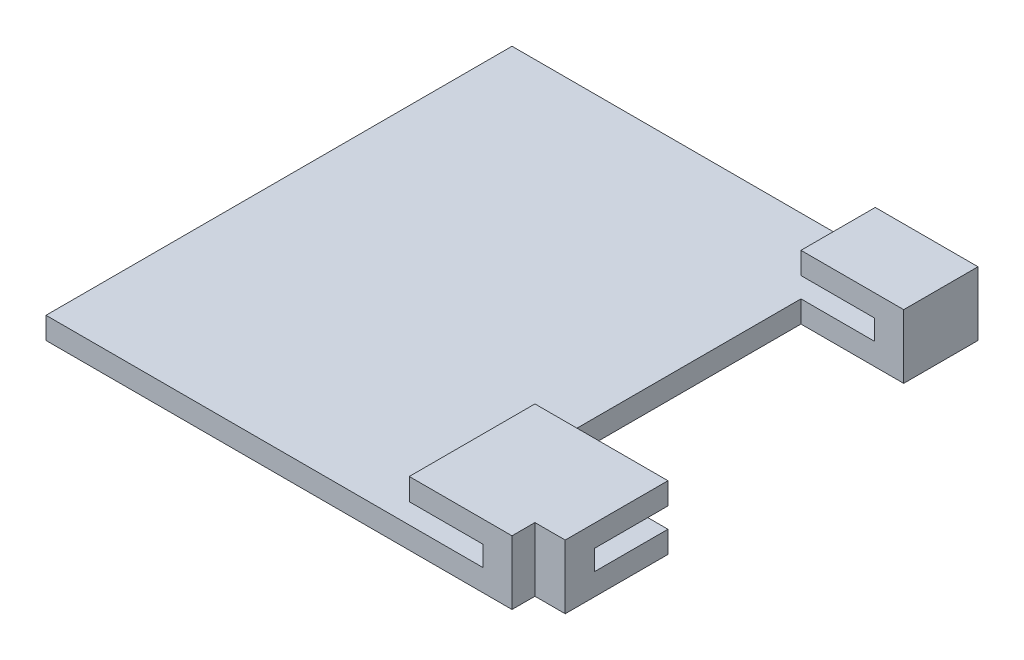
ISO-10303-21;
HEADER;
FILE_DESCRIPTION(('STEP AP214'),'2;1');
FILE_NAME('part.step','',(''),(''),'','','');
FILE_SCHEMA(('AUTOMOTIVE_DESIGN { 1 0 10303 214 1 1 1 1 }'));
ENDSEC;
DATA;
#1=APPLICATION_CONTEXT('core data for automotive mechanical design processes');
#2=APPLICATION_PROTOCOL_DEFINITION('international standard','automotive_design',2000,#1);
#3=PRODUCT_CONTEXT('',#1,'mechanical');
#4=PRODUCT('Part','Part','',(#3));
#5=PRODUCT_RELATED_PRODUCT_CATEGORY('part','',(#4));
#6=PRODUCT_DEFINITION_FORMATION('','',#4);
#7=PRODUCT_DEFINITION_CONTEXT('part definition',#1,'design');
#8=PRODUCT_DEFINITION('design','',#6,#7);
#9=PRODUCT_DEFINITION_SHAPE('','',#8);
#10=(LENGTH_UNIT() NAMED_UNIT(*) SI_UNIT(.MILLI.,.METRE.));
#11=(NAMED_UNIT(*) PLANE_ANGLE_UNIT() SI_UNIT($,.RADIAN.));
#12=(NAMED_UNIT(*) SI_UNIT($,.STERADIAN.) SOLID_ANGLE_UNIT());
#13=UNCERTAINTY_MEASURE_WITH_UNIT(LENGTH_MEASURE(1.E-05),#10,'distance_accuracy_value','');
#14=(GEOMETRIC_REPRESENTATION_CONTEXT(3) GLOBAL_UNCERTAINTY_ASSIGNED_CONTEXT((#13)) GLOBAL_UNIT_ASSIGNED_CONTEXT((#10,
#11,#12)) REPRESENTATION_CONTEXT('',''));
#15=CARTESIAN_POINT('',(0.,0.,0.));
#16=DIRECTION('',(0.,0.,1.));
#17=DIRECTION('',(1.,0.,0.));
#18=AXIS2_PLACEMENT_3D('',#15,#16,#17);
#19=CARTESIAN_POINT('',(0.,-4.58124991800001,11.699999968));
#20=DIRECTION('',(0.,0.,-1.));
#21=DIRECTION('',(-1.,0.,0.));
#22=AXIS2_PLACEMENT_3D('',#19,#20,#21);
#23=PLANE('',#22);
#24=DIRECTION('',(1.,0.,0.));
#25=VECTOR('',#24,1.);
#26=CARTESIAN_POINT('',(8.024999952,-2.199999918,11.699999968));
#27=LINE('',#26,#25);
#28=CARTESIAN_POINT('',(0.,-2.199999918,11.699999968));
#29=VERTEX_POINT('',#28);
#30=CARTESIAN_POINT('',(14.501999952,-2.19999991800001,11.699999968));
#31=VERTEX_POINT('',#30);
#32=EDGE_CURVE('E239',#29,#31,#27,.T.);
#33=ORIENTED_EDGE('',*,*,#32,.T.);
#34=DIRECTION('',(0.,1.,0.));
#35=VECTOR('',#34,1.);
#36=CARTESIAN_POINT('',(14.501999952,0.,11.699999968));
#37=LINE('',#36,#35);
#38=CARTESIAN_POINT('',(14.501999952,-4.581249918,11.699999968));
#39=VERTEX_POINT('',#38);
#40=EDGE_CURVE('E350',#39,#31,#37,.T.);
#41=ORIENTED_EDGE('',*,*,#40,.F.);
#42=DIRECTION('',(-1.,0.,0.));
#43=VECTOR('',#42,1.);
#44=CARTESIAN_POINT('',(0.,-4.58124991800001,11.699999968));
#45=LINE('',#44,#43);
#46=CARTESIAN_POINT('',(0.,-4.58124991800001,11.699999968));
#47=VERTEX_POINT('',#46);
#48=EDGE_CURVE('E354',#39,#47,#45,.T.);
#49=ORIENTED_EDGE('',*,*,#48,.T.);
#50=DIRECTION('',(0.,1.,0.));
#51=VECTOR('',#50,1.);
#52=CARTESIAN_POINT('',(0.,-4.58124991800001,11.699999968));
#53=LINE('',#52,#51);
#54=EDGE_CURVE('E302',#47,#29,#53,.T.);
#55=ORIENTED_EDGE('',*,*,#54,.T.);
#56=EDGE_LOOP('',(#33,#41,#49,#55));
#57=FACE_BOUND('',#56,.T.);
#58=ADVANCED_FACE('F41',(#57),#23,.T.);
#59=CARTESIAN_POINT('',(11.199999952,-4.581249918,25.4));
#60=DIRECTION('',(-1.,0.,0.));
#61=DIRECTION('',(0.,-1.,0.));
#62=AXIS2_PLACEMENT_3D('',#59,#60,#61);
#63=PLANE('',#62);
#64=DIRECTION('',(0.,-1.,0.));
#65=VECTOR('',#64,1.);
#66=CARTESIAN_POINT('',(11.199999952,0.,22.89999992));
#67=LINE('',#66,#65);
#68=CARTESIAN_POINT('',(11.199999952,2.38125,22.89999992));
#69=VERTEX_POINT('',#68);
#70=CARTESIAN_POINT('',(11.199999952,-4.581249918,22.89999992));
#71=VERTEX_POINT('',#70);
#72=EDGE_CURVE('E60',#69,#71,#67,.T.);
#73=ORIENTED_EDGE('',*,*,#72,.F.);
#74=DIRECTION('',(0.,0.,-1.));
#75=VECTOR('',#74,1.);
#76=CARTESIAN_POINT('',(11.199999952,2.38125,25.4));
#77=LINE('',#76,#75);
#78=CARTESIAN_POINT('',(11.199999952,2.38125,25.4));
#79=VERTEX_POINT('',#78);
#80=EDGE_CURVE('E263',#79,#69,#77,.T.);
#81=ORIENTED_EDGE('',*,*,#80,.F.);
#82=DIRECTION('',(0.,1.,0.));
#83=VECTOR('',#82,1.);
#84=CARTESIAN_POINT('',(11.199999952,-4.581249918,25.4));
#85=LINE('',#84,#83);
#86=CARTESIAN_POINT('',(11.199999952,-4.581249918,25.4));
#87=VERTEX_POINT('',#86);
#88=EDGE_CURVE('E318',#87,#79,#85,.T.);
#89=ORIENTED_EDGE('',*,*,#88,.F.);
#90=DIRECTION('',(0.,0.,-1.));
#91=VECTOR('',#90,1.);
#92=CARTESIAN_POINT('',(11.199999952,-4.581249918,25.4));
#93=LINE('',#92,#91);
#94=EDGE_CURVE('E56',#87,#71,#93,.T.);
#95=ORIENTED_EDGE('',*,*,#94,.T.);
#96=EDGE_LOOP('',(#73,#81,#89,#95));
#97=FACE_BOUND('',#96,.T.);
#98=ADVANCED_FACE('F340',(#97),#63,.F.);
#99=CARTESIAN_POINT('',(0.,2.38125,25.4));
#100=DIRECTION('',(1.,0.,0.));
#101=DIRECTION('',(0.,1.,0.));
#102=AXIS2_PLACEMENT_3D('',#99,#100,#101);
#103=PLANE('',#102);
#104=CARTESIAN_POINT('',(0.,0.,11.699999968));
#105=VERTEX_POINT('',#104);
#106=CARTESIAN_POINT('',(0.,2.38125,11.699999968));
#107=VERTEX_POINT('',#106);
#108=EDGE_CURVE('E331',#105,#107,#53,.T.);
#109=ORIENTED_EDGE('',*,*,#108,.F.);
#110=DIRECTION('',(0.,0.,-1.));
#111=VECTOR('',#110,1.);
#112=CARTESIAN_POINT('',(0.,0.,25.4));
#113=LINE('',#112,#111);
#114=CARTESIAN_POINT('',(0.,0.,25.4));
#115=VERTEX_POINT('',#114);
#116=EDGE_CURVE('E11',#115,#105,#113,.T.);
#117=ORIENTED_EDGE('',*,*,#116,.F.);
#118=DIRECTION('',(0.,-1.,0.));
#119=VECTOR('',#118,1.);
#120=CARTESIAN_POINT('',(0.,2.38125,25.4));
#121=LINE('',#120,#119);
#122=CARTESIAN_POINT('',(0.,2.38125,25.4));
#123=VERTEX_POINT('',#122);
#124=EDGE_CURVE('E258',#123,#115,#121,.T.);
#125=ORIENTED_EDGE('',*,*,#124,.F.);
#126=DIRECTION('',(0.,0.,-1.));
#127=VECTOR('',#126,1.);
#128=CARTESIAN_POINT('',(0.,2.38125,25.4));
#129=LINE('',#128,#127);
#130=EDGE_CURVE('E259',#123,#107,#129,.T.);
#131=ORIENTED_EDGE('',*,*,#130,.T.);
#132=EDGE_LOOP('',(#109,#117,#125,#131));
#133=FACE_BOUND('',#132,.T.);
#134=ADVANCED_FACE('F43',(#133),#103,.F.);
#135=DIRECTION('',(0.,1.,0.));
#136=VECTOR('',#135,1.);
#137=CARTESIAN_POINT('',(0.,-4.58124991800001,-17.299999944));
#138=LINE('',#137,#136);
#139=CARTESIAN_POINT('',(0.,0.,-17.299999944));
#140=VERTEX_POINT('',#139);
#141=CARTESIAN_POINT('',(0.,2.38125,-17.299999944));
#142=VERTEX_POINT('',#141);
#143=EDGE_CURVE('E291',#140,#142,#138,.T.);
#144=ORIENTED_EDGE('',*,*,#143,.T.);
#145=CARTESIAN_POINT('',(0.,2.38125,-25.4));
#146=VERTEX_POINT('',#145);
#147=EDGE_CURVE('E235',#142,#146,#129,.T.);
#148=ORIENTED_EDGE('',*,*,#147,.T.);
#149=DIRECTION('',(0.,-1.,0.));
#150=VECTOR('',#149,1.);
#151=CARTESIAN_POINT('',(0.,2.38125,-25.4));
#152=LINE('',#151,#150);
#153=CARTESIAN_POINT('',(0.,0.,-25.4));
#154=VERTEX_POINT('',#153);
#155=EDGE_CURVE('E228',#146,#154,#152,.T.);
#156=ORIENTED_EDGE('',*,*,#155,.T.);
#157=EDGE_CURVE('E49',#140,#154,#113,.T.);
#158=ORIENTED_EDGE('',*,*,#157,.F.);
#159=EDGE_LOOP('',(#144,#148,#156,#158));
#160=FACE_BOUND('',#159,.T.);
#161=ADVANCED_FACE('F233',(#160),#103,.F.);
#162=CARTESIAN_POINT('',(0.,0.,25.4));
#163=DIRECTION('',(0.,1.,0.));
#164=DIRECTION('',(0.,0.,1.));
#165=AXIS2_PLACEMENT_3D('',#162,#163,#164);
#166=PLANE('',#165);
#167=DIRECTION('',(-1.,0.,0.));
#168=VECTOR('',#167,1.);
#169=CARTESIAN_POINT('',(0.,0.,11.699999968));
#170=LINE('',#169,#168);
#171=CARTESIAN_POINT('',(14.501999952,0.,11.699999968));
#172=VERTEX_POINT('',#171);
#173=EDGE_CURVE('E237',#172,#105,#170,.T.);
#174=ORIENTED_EDGE('',*,*,#173,.F.);
#175=DIRECTION('',(0.,0.,1.));
#176=VECTOR('',#175,1.);
#177=CARTESIAN_POINT('',(14.501999952,0.,0.));
#178=LINE('',#177,#176);
#179=CARTESIAN_POINT('',(14.501999952,0.,19.72499992));
#180=VERTEX_POINT('',#179);
#181=EDGE_CURVE('E380',#172,#180,#178,.T.);
#182=ORIENTED_EDGE('',*,*,#181,.T.);
#183=DIRECTION('',(-1.,0.,0.));
#184=VECTOR('',#183,1.);
#185=CARTESIAN_POINT('',(14.501999952,0.,19.72499992));
#186=LINE('',#185,#184);
#187=CARTESIAN_POINT('',(8.02499995199999,0.,19.72499992));
#188=VERTEX_POINT('',#187);
#189=EDGE_CURVE('E190',#180,#188,#186,.T.);
#190=ORIENTED_EDGE('',*,*,#189,.T.);
#191=DIRECTION('',(0.,0.,-1.));
#192=VECTOR('',#191,1.);
#193=CARTESIAN_POINT('',(8.024999952,0.,25.4));
#194=LINE('',#193,#192);
#195=CARTESIAN_POINT('',(8.024999952,0.,25.4));
#196=VERTEX_POINT('',#195);
#197=EDGE_CURVE('E199',#196,#188,#194,.T.);
#198=ORIENTED_EDGE('',*,*,#197,.F.);
#199=DIRECTION('',(1.,0.,0.));
#200=VECTOR('',#199,1.);
#201=CARTESIAN_POINT('',(0.,0.,25.4));
#202=LINE('',#201,#200);
#203=EDGE_CURVE('E311',#115,#196,#202,.T.);
#204=ORIENTED_EDGE('',*,*,#203,.F.);
#205=ORIENTED_EDGE('',*,*,#116,.T.);
#206=EDGE_LOOP('',(#174,#182,#190,#198,#204,#205));
#207=FACE_BOUND('',#206,.T.);
#208=ADVANCED_FACE('F333',(#207),#166,.F.);
#209=DIRECTION('',(1.,0.,0.));
#210=VECTOR('',#209,1.);
#211=CARTESIAN_POINT('',(0.,0.,-17.299999944));
#212=LINE('',#211,#210);
#213=CARTESIAN_POINT('',(8.024999952,0.,-17.299999944));
#214=VERTEX_POINT('',#213);
#215=EDGE_CURVE('E220',#140,#214,#212,.T.);
#216=ORIENTED_EDGE('',*,*,#215,.F.);
#217=ORIENTED_EDGE('',*,*,#157,.T.);
#218=DIRECTION('',(1.,0.,0.));
#219=VECTOR('',#218,1.);
#220=CARTESIAN_POINT('',(0.,0.,-25.4));
#221=LINE('',#220,#219);
#222=CARTESIAN_POINT('',(8.024999952,0.,-25.4));
#223=VERTEX_POINT('',#222);
#224=EDGE_CURVE('E218',#154,#223,#221,.T.);
#225=ORIENTED_EDGE('',*,*,#224,.T.);
#226=EDGE_CURVE('E205',#214,#223,#194,.T.);
#227=ORIENTED_EDGE('',*,*,#226,.F.);
#228=EDGE_LOOP('',(#216,#217,#225,#227));
#229=FACE_BOUND('',#228,.T.);
#230=ADVANCED_FACE('F216',(#229),#166,.F.);
#231=CARTESIAN_POINT('',(8.024999952,0.,25.4));
#232=DIRECTION('',(1.,0.,0.));
#233=DIRECTION('',(0.,0.,-1.));
#234=AXIS2_PLACEMENT_3D('',#231,#232,#233);
#235=PLANE('',#234);
#236=ORIENTED_EDGE('',*,*,#197,.T.);
#237=DIRECTION('',(0.,1.,0.));
#238=VECTOR('',#237,1.);
#239=CARTESIAN_POINT('',(8.02499995199999,0.,19.72499992));
#240=LINE('',#239,#238);
#241=CARTESIAN_POINT('',(8.02499995199999,-2.199999918,19.72499992));
#242=VERTEX_POINT('',#241);
#243=EDGE_CURVE('E182',#242,#188,#240,.T.);
#244=ORIENTED_EDGE('',*,*,#243,.F.);
#245=DIRECTION('',(0.,0.,-1.));
#246=VECTOR('',#245,1.);
#247=CARTESIAN_POINT('',(8.024999952,-2.199999918,25.4));
#248=LINE('',#247,#246);
#249=CARTESIAN_POINT('',(8.024999952,-2.199999918,25.4));
#250=VERTEX_POINT('',#249);
#251=EDGE_CURVE('E196',#250,#242,#248,.T.);
#252=ORIENTED_EDGE('',*,*,#251,.F.);
#253=DIRECTION('',(0.,-1.,0.));
#254=VECTOR('',#253,1.);
#255=CARTESIAN_POINT('',(8.024999952,0.,25.4));
#256=LINE('',#255,#254);
#257=EDGE_CURVE('E313',#196,#250,#256,.T.);
#258=ORIENTED_EDGE('',*,*,#257,.F.);
#259=EDGE_LOOP('',(#236,#244,#252,#258));
#260=FACE_BOUND('',#259,.T.);
#261=ADVANCED_FACE('F194',(#260),#235,.F.);
#262=DIRECTION('',(0.,-1.,0.));
#263=VECTOR('',#262,1.);
#264=CARTESIAN_POINT('',(8.024999952,0.,-17.299999944));
#265=LINE('',#264,#263);
#266=CARTESIAN_POINT('',(8.024999952,-2.199999918,-17.299999944));
#267=VERTEX_POINT('',#266);
#268=EDGE_CURVE('E301',#214,#267,#265,.T.);
#269=ORIENTED_EDGE('',*,*,#268,.F.);
#270=ORIENTED_EDGE('',*,*,#226,.T.);
#271=DIRECTION('',(0.,-1.,0.));
#272=VECTOR('',#271,1.);
#273=CARTESIAN_POINT('',(8.024999952,0.,-25.4));
#274=LINE('',#273,#272);
#275=CARTESIAN_POINT('',(8.024999952,-2.199999918,-25.4));
#276=VERTEX_POINT('',#275);
#277=EDGE_CURVE('E231',#223,#276,#274,.T.);
#278=ORIENTED_EDGE('',*,*,#277,.T.);
#279=EDGE_CURVE('E206',#267,#276,#248,.T.);
#280=ORIENTED_EDGE('',*,*,#279,.F.);
#281=EDGE_LOOP('',(#269,#270,#278,#280));
#282=FACE_BOUND('',#281,.T.);
#283=ADVANCED_FACE('F426',(#282),#235,.F.);
#284=CARTESIAN_POINT('',(8.024999952,-2.199999918,25.4));
#285=DIRECTION('',(0.,-1.,0.));
#286=DIRECTION('',(1.,0.,0.));
#287=AXIS2_PLACEMENT_3D('',#284,#285,#286);
#288=PLANE('',#287);
#289=ORIENTED_EDGE('',*,*,#32,.F.);
#290=DIRECTION('',(0.,0.,-1.));
#291=VECTOR('',#290,1.);
#292=CARTESIAN_POINT('',(0.,-2.199999918,25.4));
#293=LINE('',#292,#291);
#294=CARTESIAN_POINT('',(0.,-2.199999918,-17.299999944));
#295=VERTEX_POINT('',#294);
#296=EDGE_CURVE('E305',#29,#295,#293,.T.);
#297=ORIENTED_EDGE('',*,*,#296,.T.);
#298=DIRECTION('',(-1.,0.,0.));
#299=VECTOR('',#298,1.);
#300=CARTESIAN_POINT('',(8.024999952,-2.199999918,-17.299999944));
#301=LINE('',#300,#299);
#302=EDGE_CURVE('E299',#267,#295,#301,.T.);
#303=ORIENTED_EDGE('',*,*,#302,.F.);
#304=ORIENTED_EDGE('',*,*,#279,.T.);
#305=DIRECTION('',(-1.,0.,0.));
#306=VECTOR('',#305,1.);
#307=CARTESIAN_POINT('',(8.024999952,-2.199999918,-25.4));
#308=LINE('',#307,#306);
#309=CARTESIAN_POINT('',(-39.600000048,-2.19999991800001,-25.4));
#310=VERTEX_POINT('',#309);
#311=EDGE_CURVE('E246',#276,#310,#308,.T.);
#312=ORIENTED_EDGE('',*,*,#311,.T.);
#313=DIRECTION('',(0.,0.,-1.));
#314=VECTOR('',#313,1.);
#315=CARTESIAN_POINT('',(-39.600000048,-2.19999991800001,25.4));
#316=LINE('',#315,#314);
#317=CARTESIAN_POINT('',(-39.600000048,-2.19999991800001,25.4));
#318=VERTEX_POINT('',#317);
#319=EDGE_CURVE('E208',#318,#310,#316,.T.);
#320=ORIENTED_EDGE('',*,*,#319,.F.);
#321=DIRECTION('',(-1.,0.,0.));
#322=VECTOR('',#321,1.);
#323=CARTESIAN_POINT('',(8.024999952,-2.199999918,25.4));
#324=LINE('',#323,#322);
#325=EDGE_CURVE('E204',#250,#318,#324,.T.);
#326=ORIENTED_EDGE('',*,*,#325,.F.);
#327=ORIENTED_EDGE('',*,*,#251,.T.);
#328=DIRECTION('',(-1.,0.,0.));
#329=VECTOR('',#328,1.);
#330=CARTESIAN_POINT('',(14.501999952,-2.19999991800001,19.72499992));
#331=LINE('',#330,#329);
#332=CARTESIAN_POINT('',(14.501999952,-2.19999991800001,19.72499992));
#333=VERTEX_POINT('',#332);
#334=EDGE_CURVE('E178',#333,#242,#331,.T.);
#335=ORIENTED_EDGE('',*,*,#334,.F.);
#336=DIRECTION('',(0.,0.,1.));
#337=VECTOR('',#336,1.);
#338=CARTESIAN_POINT('',(14.501999952,-2.19999991800001,0.));
#339=LINE('',#338,#337);
#340=EDGE_CURVE('E369',#31,#333,#339,.T.);
#341=ORIENTED_EDGE('',*,*,#340,.F.);
#342=EDGE_LOOP('',(#289,#297,#303,#304,#312,#320,#326,#327,#335,#341));
#343=FACE_BOUND('',#342,.T.);
#344=ADVANCED_FACE('F202',(#343),#288,.F.);
#345=CARTESIAN_POINT('',(-39.600000048,-4.581249918,25.4));
#346=DIRECTION('',(0.,1.,0.));
#347=DIRECTION('',(-1.,0.,0.));
#348=AXIS2_PLACEMENT_3D('',#345,#346,#347);
#349=PLANE('',#348);
#350=ORIENTED_EDGE('',*,*,#48,.F.);
#351=DIRECTION('',(0.,0.,-1.));
#352=VECTOR('',#351,1.);
#353=CARTESIAN_POINT('',(14.501999952,-4.581249918,0.));
#354=LINE('',#353,#352);
#355=CARTESIAN_POINT('',(14.501999952,-4.581249918,22.89999992));
#356=VERTEX_POINT('',#355);
#357=EDGE_CURVE('E375',#356,#39,#354,.T.);
#358=ORIENTED_EDGE('',*,*,#357,.F.);
#359=DIRECTION('',(-1.,0.,0.));
#360=VECTOR('',#359,1.);
#361=CARTESIAN_POINT('',(14.501999952,-4.581249918,22.89999992));
#362=LINE('',#361,#360);
#363=EDGE_CURVE('E339',#356,#71,#362,.T.);
#364=ORIENTED_EDGE('',*,*,#363,.T.);
#365=ORIENTED_EDGE('',*,*,#94,.F.);
#366=DIRECTION('',(1.,0.,0.));
#367=VECTOR('',#366,1.);
#368=CARTESIAN_POINT('',(-39.600000048,-4.581249918,25.4));
#369=LINE('',#368,#367);
#370=CARTESIAN_POINT('',(-39.600000048,-4.581249918,25.4));
#371=VERTEX_POINT('',#370);
#372=EDGE_CURVE('E317',#371,#87,#369,.T.);
#373=ORIENTED_EDGE('',*,*,#372,.F.);
#374=DIRECTION('',(0.,0.,-1.));
#375=VECTOR('',#374,1.);
#376=CARTESIAN_POINT('',(-39.600000048,-4.581249918,25.4));
#377=LINE('',#376,#375);
#378=CARTESIAN_POINT('',(-39.600000048,-4.581249918,-25.4));
#379=VERTEX_POINT('',#378);
#380=EDGE_CURVE('E266',#371,#379,#377,.T.);
#381=ORIENTED_EDGE('',*,*,#380,.T.);
#382=DIRECTION('',(1.,0.,0.));
#383=VECTOR('',#382,1.);
#384=CARTESIAN_POINT('',(-39.600000048,-4.581249918,-25.4));
#385=LINE('',#384,#383);
#386=CARTESIAN_POINT('',(11.199999952,-4.581249918,-25.4));
#387=VERTEX_POINT('',#386);
#388=EDGE_CURVE('E250',#379,#387,#385,.T.);
#389=ORIENTED_EDGE('',*,*,#388,.T.);
#390=CARTESIAN_POINT('',(11.199999952,-4.581249918,-17.299999944));
#391=VERTEX_POINT('',#390);
#392=EDGE_CURVE('E265',#391,#387,#93,.T.);
#393=ORIENTED_EDGE('',*,*,#392,.F.);
#394=DIRECTION('',(1.,0.,0.));
#395=VECTOR('',#394,1.);
#396=CARTESIAN_POINT('',(0.,-4.58124991800001,-17.299999944));
#397=LINE('',#396,#395);
#398=CARTESIAN_POINT('',(0.,-4.58124991800001,-17.299999944));
#399=VERTEX_POINT('',#398);
#400=EDGE_CURVE('E283',#399,#391,#397,.T.);
#401=ORIENTED_EDGE('',*,*,#400,.F.);
#402=DIRECTION('',(0.,0.,1.));
#403=VECTOR('',#402,1.);
#404=CARTESIAN_POINT('',(0.,-4.58124991800001,0.));
#405=LINE('',#404,#403);
#406=EDGE_CURVE('E292',#399,#47,#405,.T.);
#407=ORIENTED_EDGE('',*,*,#406,.T.);
#408=EDGE_LOOP('',(#350,#358,#364,#365,#373,#381,#389,#393,#401,#407));
#409=FACE_BOUND('',#408,.T.);
#410=ADVANCED_FACE('F280',(#409),#349,.F.);
#411=DIRECTION('',(0.,1.,0.));
#412=VECTOR('',#411,1.);
#413=CARTESIAN_POINT('',(11.199999952,-4.581249918,-17.299999944));
#414=LINE('',#413,#412);
#415=CARTESIAN_POINT('',(11.199999952,2.38125,-17.299999944));
#416=VERTEX_POINT('',#415);
#417=EDGE_CURVE('E288',#391,#416,#414,.T.);
#418=ORIENTED_EDGE('',*,*,#417,.F.);
#419=ORIENTED_EDGE('',*,*,#392,.T.);
#420=DIRECTION('',(0.,1.,0.));
#421=VECTOR('',#420,1.);
#422=CARTESIAN_POINT('',(11.199999952,-4.581249918,-25.4));
#423=LINE('',#422,#421);
#424=CARTESIAN_POINT('',(11.199999952,2.38125,-25.4));
#425=VERTEX_POINT('',#424);
#426=EDGE_CURVE('E253',#387,#425,#423,.T.);
#427=ORIENTED_EDGE('',*,*,#426,.T.);
#428=EDGE_CURVE('E262',#416,#425,#77,.T.);
#429=ORIENTED_EDGE('',*,*,#428,.F.);
#430=EDGE_LOOP('',(#418,#419,#427,#429));
#431=FACE_BOUND('',#430,.T.);
#432=ADVANCED_FACE('F286',(#431),#63,.F.);
#433=CARTESIAN_POINT('',(11.199999952,2.38125,25.4));
#434=DIRECTION('',(0.,-1.,0.));
#435=DIRECTION('',(1.,0.,0.));
#436=AXIS2_PLACEMENT_3D('',#433,#434,#435);
#437=PLANE('',#436);
#438=DIRECTION('',(-1.,0.,0.));
#439=VECTOR('',#438,1.);
#440=CARTESIAN_POINT('',(0.,2.38125,11.699999968));
#441=LINE('',#440,#439);
#442=CARTESIAN_POINT('',(14.501999952,2.38125,11.699999968));
#443=VERTEX_POINT('',#442);
#444=EDGE_CURVE('E189',#443,#107,#441,.T.);
#445=ORIENTED_EDGE('',*,*,#444,.T.);
#446=ORIENTED_EDGE('',*,*,#130,.F.);
#447=DIRECTION('',(-1.,0.,0.));
#448=VECTOR('',#447,1.);
#449=CARTESIAN_POINT('',(11.199999952,2.38125,25.4));
#450=LINE('',#449,#448);
#451=EDGE_CURVE('E242',#79,#123,#450,.T.);
#452=ORIENTED_EDGE('',*,*,#451,.F.);
#453=ORIENTED_EDGE('',*,*,#80,.T.);
#454=DIRECTION('',(-1.,0.,0.));
#455=VECTOR('',#454,1.);
#456=CARTESIAN_POINT('',(14.501999952,2.38125,22.89999992));
#457=LINE('',#456,#455);
#458=CARTESIAN_POINT('',(14.501999952,2.38125,22.89999992));
#459=VERTEX_POINT('',#458);
#460=EDGE_CURVE('E343',#459,#69,#457,.T.);
#461=ORIENTED_EDGE('',*,*,#460,.F.);
#462=DIRECTION('',(0.,0.,1.));
#463=VECTOR('',#462,1.);
#464=CARTESIAN_POINT('',(14.501999952,2.38125,0.));
#465=LINE('',#464,#463);
#466=EDGE_CURVE('E387',#443,#459,#465,.T.);
#467=ORIENTED_EDGE('',*,*,#466,.F.);
#468=EDGE_LOOP('',(#445,#446,#452,#453,#461,#467));
#469=FACE_BOUND('',#468,.T.);
#470=ADVANCED_FACE('F327',(#469),#437,.F.);
#471=DIRECTION('',(1.,0.,0.));
#472=VECTOR('',#471,1.);
#473=CARTESIAN_POINT('',(0.,2.38125,-17.299999944));
#474=LINE('',#473,#472);
#475=EDGE_CURVE('E356',#142,#416,#474,.T.);
#476=ORIENTED_EDGE('',*,*,#475,.T.);
#477=ORIENTED_EDGE('',*,*,#428,.T.);
#478=DIRECTION('',(-1.,0.,0.));
#479=VECTOR('',#478,1.);
#480=CARTESIAN_POINT('',(11.199999952,2.38125,-25.4));
#481=LINE('',#480,#479);
#482=EDGE_CURVE('E256',#425,#146,#481,.T.);
#483=ORIENTED_EDGE('',*,*,#482,.T.);
#484=ORIENTED_EDGE('',*,*,#147,.F.);
#485=EDGE_LOOP('',(#476,#477,#483,#484));
#486=FACE_BOUND('',#485,.T.);
#487=ADVANCED_FACE('F423',(#486),#437,.F.);
#488=CARTESIAN_POINT('',(-39.600000048,-2.19999991800001,25.4));
#489=DIRECTION('',(1.,0.,0.));
#490=DIRECTION('',(0.,1.,0.));
#491=AXIS2_PLACEMENT_3D('',#488,#489,#490);
#492=PLANE('',#491);
#493=DIRECTION('',(0.,-1.,0.));
#494=VECTOR('',#493,1.);
#495=CARTESIAN_POINT('',(-39.600000048,-2.19999991800001,-25.4));
#496=LINE('',#495,#494);
#497=EDGE_CURVE('E248',#310,#379,#496,.T.);
#498=ORIENTED_EDGE('',*,*,#497,.T.);
#499=ORIENTED_EDGE('',*,*,#380,.F.);
#500=DIRECTION('',(0.,-1.,0.));
#501=VECTOR('',#500,1.);
#502=CARTESIAN_POINT('',(-39.600000048,-2.19999991800001,25.4));
#503=LINE('',#502,#501);
#504=EDGE_CURVE('E277',#318,#371,#503,.T.);
#505=ORIENTED_EDGE('',*,*,#504,.F.);
#506=ORIENTED_EDGE('',*,*,#319,.T.);
#507=EDGE_LOOP('',(#498,#499,#505,#506));
#508=FACE_BOUND('',#507,.T.);
#509=ADVANCED_FACE('F276',(#508),#492,.F.);
#510=CARTESIAN_POINT('',(0.,0.,25.4));
#511=DIRECTION('',(0.,0.,1.));
#512=DIRECTION('',(1.,0.,0.));
#513=AXIS2_PLACEMENT_3D('',#510,#511,#512);
#514=PLANE('',#513);
#515=ORIENTED_EDGE('',*,*,#124,.T.);
#516=ORIENTED_EDGE('',*,*,#203,.T.);
#517=ORIENTED_EDGE('',*,*,#257,.T.);
#518=ORIENTED_EDGE('',*,*,#325,.T.);
#519=ORIENTED_EDGE('',*,*,#504,.T.);
#520=ORIENTED_EDGE('',*,*,#372,.T.);
#521=ORIENTED_EDGE('',*,*,#88,.T.);
#522=ORIENTED_EDGE('',*,*,#451,.T.);
#523=EDGE_LOOP('',(#515,#516,#517,#518,#519,#520,#521,#522));
#524=FACE_BOUND('',#523,.T.);
#525=ADVANCED_FACE('F322',(#524),#514,.T.);
#526=CARTESIAN_POINT('',(0.,0.,-25.4));
#527=DIRECTION('',(0.,0.,1.));
#528=DIRECTION('',(1.,0.,0.));
#529=AXIS2_PLACEMENT_3D('',#526,#527,#528);
#530=PLANE('',#529);
#531=ORIENTED_EDGE('',*,*,#155,.F.);
#532=ORIENTED_EDGE('',*,*,#482,.F.);
#533=ORIENTED_EDGE('',*,*,#426,.F.);
#534=ORIENTED_EDGE('',*,*,#388,.F.);
#535=ORIENTED_EDGE('',*,*,#497,.F.);
#536=ORIENTED_EDGE('',*,*,#311,.F.);
#537=ORIENTED_EDGE('',*,*,#277,.F.);
#538=ORIENTED_EDGE('',*,*,#224,.F.);
#539=EDGE_LOOP('',(#531,#532,#533,#534,#535,#536,#537,#538));
#540=FACE_BOUND('',#539,.T.);
#541=ADVANCED_FACE('F226',(#540),#530,.F.);
#542=DIRECTION('',(0.,1.,0.));
#543=VECTOR('',#542,1.);
#544=CARTESIAN_POINT('',(14.501999952,0.,11.699999968));
#545=LINE('',#544,#543);
#546=EDGE_CURVE('E384',#172,#443,#545,.T.);
#547=ORIENTED_EDGE('',*,*,#546,.F.);
#548=ORIENTED_EDGE('',*,*,#173,.T.);
#549=ORIENTED_EDGE('',*,*,#108,.T.);
#550=ORIENTED_EDGE('',*,*,#444,.F.);
#551=EDGE_LOOP('',(#547,#548,#549,#550));
#552=FACE_BOUND('',#551,.T.);
#553=ADVANCED_FACE('F389',(#552),#23,.T.);
#554=CARTESIAN_POINT('',(0.,-4.58124991800001,0.));
#555=DIRECTION('',(-1.,0.,0.));
#556=DIRECTION('',(0.,-1.,0.));
#557=AXIS2_PLACEMENT_3D('',#554,#555,#556);
#558=PLANE('',#557);
#559=ORIENTED_EDGE('',*,*,#54,.F.);
#560=ORIENTED_EDGE('',*,*,#406,.F.);
#561=EDGE_CURVE('E294',#399,#295,#138,.T.);
#562=ORIENTED_EDGE('',*,*,#561,.T.);
#563=ORIENTED_EDGE('',*,*,#296,.F.);
#564=EDGE_LOOP('',(#559,#560,#562,#563));
#565=FACE_BOUND('',#564,.T.);
#566=ADVANCED_FACE('F366',(#565),#558,.F.);
#567=CARTESIAN_POINT('',(0.,-4.58124991800001,-17.299999944));
#568=DIRECTION('',(0.,0.,1.));
#569=DIRECTION('',(1.,0.,0.));
#570=AXIS2_PLACEMENT_3D('',#567,#568,#569);
#571=PLANE('',#570);
#572=ORIENTED_EDGE('',*,*,#215,.T.);
#573=ORIENTED_EDGE('',*,*,#268,.T.);
#574=ORIENTED_EDGE('',*,*,#302,.T.);
#575=ORIENTED_EDGE('',*,*,#561,.F.);
#576=ORIENTED_EDGE('',*,*,#400,.T.);
#577=ORIENTED_EDGE('',*,*,#417,.T.);
#578=ORIENTED_EDGE('',*,*,#475,.F.);
#579=ORIENTED_EDGE('',*,*,#143,.F.);
#580=EDGE_LOOP('',(#572,#573,#574,#575,#576,#577,#578,#579));
#581=FACE_BOUND('',#580,.T.);
#582=ADVANCED_FACE('F397',(#581),#571,.T.);
#583=CARTESIAN_POINT('',(14.501999952,0.,19.72499992));
#584=DIRECTION('',(0.,0.,1.));
#585=DIRECTION('',(1.,0.,0.));
#586=AXIS2_PLACEMENT_3D('',#583,#584,#585);
#587=PLANE('',#586);
#588=ORIENTED_EDGE('',*,*,#334,.T.);
#589=ORIENTED_EDGE('',*,*,#243,.T.);
#590=ORIENTED_EDGE('',*,*,#189,.F.);
#591=DIRECTION('',(0.,1.,0.));
#592=VECTOR('',#591,1.);
#593=CARTESIAN_POINT('',(14.501999952,0.,19.72499992));
#594=LINE('',#593,#592);
#595=EDGE_CURVE('E184',#333,#180,#594,.T.);
#596=ORIENTED_EDGE('',*,*,#595,.F.);
#597=EDGE_LOOP('',(#588,#589,#590,#596));
#598=FACE_BOUND('',#597,.T.);
#599=ADVANCED_FACE('F180',(#598),#587,.F.);
#600=CARTESIAN_POINT('',(14.501999952,0.,22.89999992));
#601=DIRECTION('',(0.,0.,-1.));
#602=DIRECTION('',(-1.,0.,0.));
#603=AXIS2_PLACEMENT_3D('',#600,#601,#602);
#604=PLANE('',#603);
#605=ORIENTED_EDGE('',*,*,#72,.T.);
#606=ORIENTED_EDGE('',*,*,#363,.F.);
#607=DIRECTION('',(0.,-1.,0.));
#608=VECTOR('',#607,1.);
#609=CARTESIAN_POINT('',(14.501999952,0.,22.89999992));
#610=LINE('',#609,#608);
#611=EDGE_CURVE('E347',#459,#356,#610,.T.);
#612=ORIENTED_EDGE('',*,*,#611,.F.);
#613=ORIENTED_EDGE('',*,*,#460,.T.);
#614=EDGE_LOOP('',(#605,#606,#612,#613));
#615=FACE_BOUND('',#614,.T.);
#616=ADVANCED_FACE('F346',(#615),#604,.F.);
#617=CARTESIAN_POINT('',(14.501999952,0.,0.));
#618=DIRECTION('',(1.,0.,0.));
#619=DIRECTION('',(0.,1.,0.));
#620=AXIS2_PLACEMENT_3D('',#617,#618,#619);
#621=PLANE('',#620);
#622=ORIENTED_EDGE('',*,*,#340,.T.);
#623=ORIENTED_EDGE('',*,*,#595,.T.);
#624=ORIENTED_EDGE('',*,*,#181,.F.);
#625=ORIENTED_EDGE('',*,*,#546,.T.);
#626=ORIENTED_EDGE('',*,*,#466,.T.);
#627=ORIENTED_EDGE('',*,*,#611,.T.);
#628=ORIENTED_EDGE('',*,*,#357,.T.);
#629=ORIENTED_EDGE('',*,*,#40,.T.);
#630=EDGE_LOOP('',(#622,#623,#624,#625,#626,#627,#628,#629));
#631=FACE_BOUND('',#630,.T.);
#632=ADVANCED_FACE('F374',(#631),#621,.T.);
#633=CLOSED_SHELL('',(#58,#98,#134,#161,#208,#230,#261,#283,#344,#410,#432,#470,#487,#509,#525,
#541,#553,#566,#582,#599,#616,#632));
#634=MANIFOLD_SOLID_BREP('B2',#633);
#635=ADVANCED_BREP_SHAPE_REPRESENTATION('',(#18,#634),#14);
#636=SHAPE_DEFINITION_REPRESENTATION(#9,#635);
ENDSEC;
END-ISO-10303-21;
